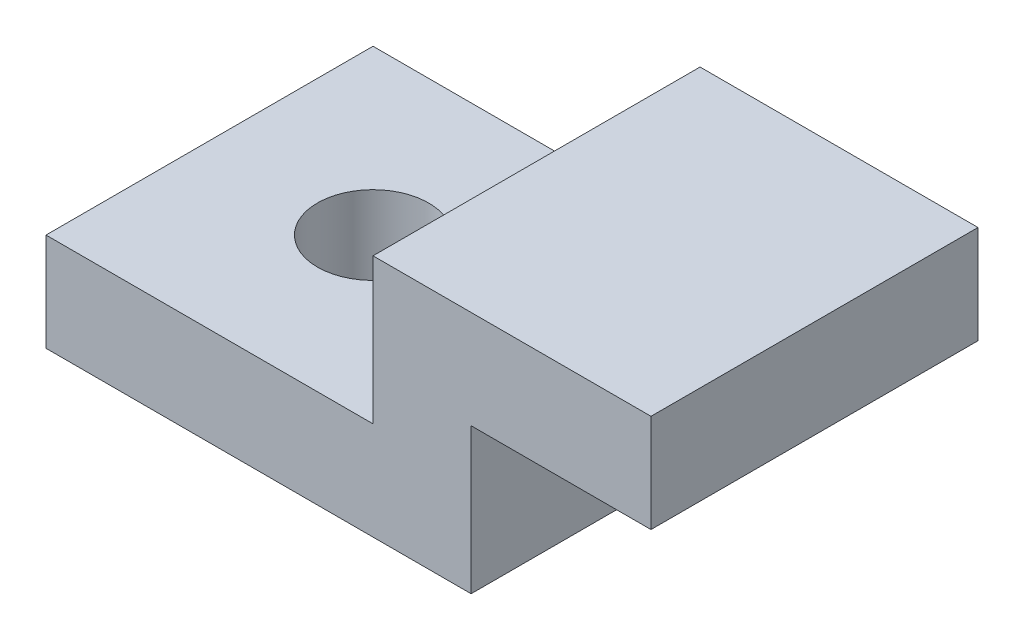
ISO-10303-21;
HEADER;
FILE_DESCRIPTION(('STEP AP214'),'2;1');
FILE_NAME('part.step','',(''),(''),'','','');
FILE_SCHEMA(('AUTOMOTIVE_DESIGN { 1 0 10303 214 1 1 1 1 }'));
ENDSEC;
DATA;
#1=APPLICATION_CONTEXT('core data for automotive mechanical design processes');
#2=APPLICATION_PROTOCOL_DEFINITION('international standard','automotive_design',2000,#1);
#3=PRODUCT_CONTEXT('',#1,'mechanical');
#4=PRODUCT('Part','Part','',(#3));
#5=PRODUCT_RELATED_PRODUCT_CATEGORY('part','',(#4));
#6=PRODUCT_DEFINITION_FORMATION('','',#4);
#7=PRODUCT_DEFINITION_CONTEXT('part definition',#1,'design');
#8=PRODUCT_DEFINITION('design','',#6,#7);
#9=PRODUCT_DEFINITION_SHAPE('','',#8);
#10=(LENGTH_UNIT() NAMED_UNIT(*) SI_UNIT(.MILLI.,.METRE.));
#11=(NAMED_UNIT(*) PLANE_ANGLE_UNIT() SI_UNIT($,.RADIAN.));
#12=(NAMED_UNIT(*) SI_UNIT($,.STERADIAN.) SOLID_ANGLE_UNIT());
#13=UNCERTAINTY_MEASURE_WITH_UNIT(LENGTH_MEASURE(1.E-05),#10,'distance_accuracy_value','');
#14=(GEOMETRIC_REPRESENTATION_CONTEXT(3) GLOBAL_UNCERTAINTY_ASSIGNED_CONTEXT((#13)) GLOBAL_UNIT_ASSIGNED_CONTEXT((#10,
#11,#12)) REPRESENTATION_CONTEXT('',''));
#15=CARTESIAN_POINT('',(0.,0.,0.));
#16=DIRECTION('',(0.,0.,1.));
#17=DIRECTION('',(1.,0.,0.));
#18=AXIS2_PLACEMENT_3D('',#15,#16,#17);
#19=CARTESIAN_POINT('',(0.,0.,5.));
#20=DIRECTION('',(-1.,0.,0.));
#21=DIRECTION('',(0.,0.,1.));
#22=AXIS2_PLACEMENT_3D('',#19,#20,#21);
#23=PLANE('',#22);
#24=DIRECTION('',(0.,1.,0.));
#25=VECTOR('',#24,1.);
#26=CARTESIAN_POINT('',(0.,0.,-5.));
#27=LINE('',#26,#25);
#28=CARTESIAN_POINT('',(0.,0.,-5.));
#29=VERTEX_POINT('',#28);
#30=CARTESIAN_POINT('',(0.,4.45,-5.));
#31=VERTEX_POINT('',#30);
#32=EDGE_CURVE('E133',#29,#31,#27,.T.);
#33=ORIENTED_EDGE('',*,*,#32,.T.);
#34=DIRECTION('',(0.,0.,-1.));
#35=VECTOR('',#34,1.);
#36=CARTESIAN_POINT('',(0.,4.45,5.));
#37=LINE('',#36,#35);
#38=CARTESIAN_POINT('',(0.,4.45,5.));
#39=VERTEX_POINT('',#38);
#40=EDGE_CURVE('E41',#39,#31,#37,.T.);
#41=ORIENTED_EDGE('',*,*,#40,.F.);
#42=DIRECTION('',(0.,1.,0.));
#43=VECTOR('',#42,1.);
#44=CARTESIAN_POINT('',(0.,0.,5.));
#45=LINE('',#44,#43);
#46=CARTESIAN_POINT('',(0.,0.,5.));
#47=VERTEX_POINT('',#46);
#48=EDGE_CURVE('E93',#47,#39,#45,.T.);
#49=ORIENTED_EDGE('',*,*,#48,.F.);
#50=DIRECTION('',(0.,0.,-1.));
#51=VECTOR('',#50,1.);
#52=CARTESIAN_POINT('',(0.,0.,5.));
#53=LINE('',#52,#51);
#54=EDGE_CURVE('E11',#47,#29,#53,.T.);
#55=ORIENTED_EDGE('',*,*,#54,.T.);
#56=EDGE_LOOP('',(#33,#41,#49,#55));
#57=FACE_BOUND('',#56,.T.);
#58=ADVANCED_FACE('F33',(#57),#23,.F.);
#59=CARTESIAN_POINT('',(0.,4.45,5.));
#60=DIRECTION('',(0.,1.,0.));
#61=DIRECTION('',(0.,0.,1.));
#62=AXIS2_PLACEMENT_3D('',#59,#60,#61);
#63=PLANE('',#62);
#64=DIRECTION('',(1.,0.,0.));
#65=VECTOR('',#64,1.);
#66=CARTESIAN_POINT('',(0.,4.45,-5.));
#67=LINE('',#66,#65);
#68=CARTESIAN_POINT('',(5.5,4.45,-5.));
#69=VERTEX_POINT('',#68);
#70=EDGE_CURVE('E135',#31,#69,#67,.T.);
#71=ORIENTED_EDGE('',*,*,#70,.T.);
#72=DIRECTION('',(0.,0.,-1.));
#73=VECTOR('',#72,1.);
#74=CARTESIAN_POINT('',(5.5,4.45,5.));
#75=LINE('',#74,#73);
#76=CARTESIAN_POINT('',(5.5,4.45,5.));
#77=VERTEX_POINT('',#76);
#78=EDGE_CURVE('E153',#77,#69,#75,.T.);
#79=ORIENTED_EDGE('',*,*,#78,.F.);
#80=DIRECTION('',(1.,0.,0.));
#81=VECTOR('',#80,1.);
#82=CARTESIAN_POINT('',(0.,4.45,5.));
#83=LINE('',#82,#81);
#84=EDGE_CURVE('E161',#39,#77,#83,.T.);
#85=ORIENTED_EDGE('',*,*,#84,.F.);
#86=ORIENTED_EDGE('',*,*,#40,.T.);
#87=EDGE_LOOP('',(#71,#79,#85,#86));
#88=FACE_BOUND('',#87,.T.);
#89=ADVANCED_FACE('F159',(#88),#63,.F.);
#90=CARTESIAN_POINT('',(5.5,4.45,5.));
#91=DIRECTION('',(-1.,0.,0.));
#92=DIRECTION('',(0.,0.,1.));
#93=AXIS2_PLACEMENT_3D('',#90,#91,#92);
#94=PLANE('',#93);
#95=DIRECTION('',(0.,1.,0.));
#96=VECTOR('',#95,1.);
#97=CARTESIAN_POINT('',(5.5,4.45,-5.));
#98=LINE('',#97,#96);
#99=CARTESIAN_POINT('',(5.5,7.45,-5.));
#100=VERTEX_POINT('',#99);
#101=EDGE_CURVE('E138',#69,#100,#98,.T.);
#102=ORIENTED_EDGE('',*,*,#101,.T.);
#103=DIRECTION('',(0.,0.,-1.));
#104=VECTOR('',#103,1.);
#105=CARTESIAN_POINT('',(5.5,7.45,5.));
#106=LINE('',#105,#104);
#107=CARTESIAN_POINT('',(5.5,7.45,5.));
#108=VERTEX_POINT('',#107);
#109=EDGE_CURVE('E150',#108,#100,#106,.T.);
#110=ORIENTED_EDGE('',*,*,#109,.F.);
#111=DIRECTION('',(0.,1.,0.));
#112=VECTOR('',#111,1.);
#113=CARTESIAN_POINT('',(5.5,4.45,5.));
#114=LINE('',#113,#112);
#115=EDGE_CURVE('E174',#77,#108,#114,.T.);
#116=ORIENTED_EDGE('',*,*,#115,.F.);
#117=ORIENTED_EDGE('',*,*,#78,.T.);
#118=EDGE_LOOP('',(#102,#110,#116,#117));
#119=FACE_BOUND('',#118,.T.);
#120=ADVANCED_FACE('F170',(#119),#94,.F.);
#121=CARTESIAN_POINT('',(5.5,7.45,5.));
#122=DIRECTION('',(0.,-1.,0.));
#123=DIRECTION('',(1.,0.,0.));
#124=AXIS2_PLACEMENT_3D('',#121,#122,#123);
#125=PLANE('',#124);
#126=DIRECTION('',(-1.,0.,0.));
#127=VECTOR('',#126,1.);
#128=CARTESIAN_POINT('',(5.5,7.45,-5.));
#129=LINE('',#128,#127);
#130=CARTESIAN_POINT('',(-3.,7.45,-5.));
#131=VERTEX_POINT('',#130);
#132=EDGE_CURVE('E140',#100,#131,#129,.T.);
#133=ORIENTED_EDGE('',*,*,#132,.T.);
#134=DIRECTION('',(0.,0.,-1.));
#135=VECTOR('',#134,1.);
#136=CARTESIAN_POINT('',(-3.,7.45,5.));
#137=LINE('',#136,#135);
#138=CARTESIAN_POINT('',(-3.,7.45,5.));
#139=VERTEX_POINT('',#138);
#140=EDGE_CURVE('E122',#139,#131,#137,.T.);
#141=ORIENTED_EDGE('',*,*,#140,.F.);
#142=DIRECTION('',(-1.,0.,0.));
#143=VECTOR('',#142,1.);
#144=CARTESIAN_POINT('',(5.5,7.45,5.));
#145=LINE('',#144,#143);
#146=EDGE_CURVE('E113',#108,#139,#145,.T.);
#147=ORIENTED_EDGE('',*,*,#146,.F.);
#148=ORIENTED_EDGE('',*,*,#109,.T.);
#149=EDGE_LOOP('',(#133,#141,#147,#148));
#150=FACE_BOUND('',#149,.T.);
#151=ADVANCED_FACE('F173',(#150),#125,.F.);
#152=CARTESIAN_POINT('',(-3.,7.45,5.));
#153=DIRECTION('',(1.,0.,0.));
#154=DIRECTION('',(0.,1.,0.));
#155=AXIS2_PLACEMENT_3D('',#152,#153,#154);
#156=PLANE('',#155);
#157=DIRECTION('',(0.,-1.,0.));
#158=VECTOR('',#157,1.);
#159=CARTESIAN_POINT('',(-3.,7.45,-5.));
#160=LINE('',#159,#158);
#161=CARTESIAN_POINT('',(-3.,3.,-5.));
#162=VERTEX_POINT('',#161);
#163=EDGE_CURVE('E121',#131,#162,#160,.T.);
#164=ORIENTED_EDGE('',*,*,#163,.T.);
#165=DIRECTION('',(0.,0.,-1.));
#166=VECTOR('',#165,1.);
#167=CARTESIAN_POINT('',(-3.,3.,5.));
#168=LINE('',#167,#166);
#169=CARTESIAN_POINT('',(-3.,3.,5.));
#170=VERTEX_POINT('',#169);
#171=EDGE_CURVE('E118',#170,#162,#168,.T.);
#172=ORIENTED_EDGE('',*,*,#171,.F.);
#173=DIRECTION('',(0.,-1.,0.));
#174=VECTOR('',#173,1.);
#175=CARTESIAN_POINT('',(-3.,7.45,5.));
#176=LINE('',#175,#174);
#177=EDGE_CURVE('E107',#139,#170,#176,.T.);
#178=ORIENTED_EDGE('',*,*,#177,.F.);
#179=ORIENTED_EDGE('',*,*,#140,.T.);
#180=EDGE_LOOP('',(#164,#172,#178,#179));
#181=FACE_BOUND('',#180,.T.);
#182=ADVANCED_FACE('F119',(#181),#156,.F.);
#183=CARTESIAN_POINT('',(-13.,3.,5.));
#184=DIRECTION('',(0.,-1.,0.));
#185=DIRECTION('',(0.,0.,-1.));
#186=AXIS2_PLACEMENT_3D('',#183,#184,#185);
#187=PLANE('',#186);
#188=CARTESIAN_POINT('',(-8.,3.,0.));
#189=DIRECTION('',(0.,1.,0.));
#190=DIRECTION('',(0.,0.,1.));
#191=AXIS2_PLACEMENT_3D('',#188,#189,#190);
#192=CIRCLE('',#191,1.69999999999999);
#193=CARTESIAN_POINT('',(-8.,3.,1.69999999999999));
#194=VERTEX_POINT('',#193);
#195=EDGE_CURVE('E182',#194,#194,#192,.T.);
#196=ORIENTED_EDGE('',*,*,#195,.F.);
#197=EDGE_LOOP('',(#196));
#198=FACE_BOUND('',#197,.T.);
#199=DIRECTION('',(-1.,0.,0.));
#200=VECTOR('',#199,1.);
#201=CARTESIAN_POINT('',(-13.,3.,-5.));
#202=LINE('',#201,#200);
#203=CARTESIAN_POINT('',(-13.,3.,-5.));
#204=VERTEX_POINT('',#203);
#205=EDGE_CURVE('E79',#162,#204,#202,.T.);
#206=ORIENTED_EDGE('',*,*,#205,.T.);
#207=DIRECTION('',(0.,0.,-1.));
#208=VECTOR('',#207,1.);
#209=CARTESIAN_POINT('',(-13.,3.,5.));
#210=LINE('',#209,#208);
#211=CARTESIAN_POINT('',(-13.,3.,5.));
#212=VERTEX_POINT('',#211);
#213=EDGE_CURVE('E123',#212,#204,#210,.T.);
#214=ORIENTED_EDGE('',*,*,#213,.F.);
#215=DIRECTION('',(-1.,0.,0.));
#216=VECTOR('',#215,1.);
#217=CARTESIAN_POINT('',(-13.,3.,5.));
#218=LINE('',#217,#216);
#219=EDGE_CURVE('E111',#170,#212,#218,.T.);
#220=ORIENTED_EDGE('',*,*,#219,.F.);
#221=ORIENTED_EDGE('',*,*,#171,.T.);
#222=EDGE_LOOP('',(#206,#214,#220,#221));
#223=FACE_BOUND('',#222,.T.);
#224=ADVANCED_FACE('F125',(#198,#223),#187,.F.);
#225=CARTESIAN_POINT('',(-13.,0.,5.));
#226=DIRECTION('',(1.,0.,0.));
#227=DIRECTION('',(0.,0.,-1.));
#228=AXIS2_PLACEMENT_3D('',#225,#226,#227);
#229=PLANE('',#228);
#230=DIRECTION('',(0.,-1.,0.));
#231=VECTOR('',#230,1.);
#232=CARTESIAN_POINT('',(-13.,0.,-5.));
#233=LINE('',#232,#231);
#234=CARTESIAN_POINT('',(-13.,0.,-5.));
#235=VERTEX_POINT('',#234);
#236=EDGE_CURVE('E86',#204,#235,#233,.T.);
#237=ORIENTED_EDGE('',*,*,#236,.T.);
#238=DIRECTION('',(0.,0.,-1.));
#239=VECTOR('',#238,1.);
#240=CARTESIAN_POINT('',(-13.,0.,5.));
#241=LINE('',#240,#239);
#242=CARTESIAN_POINT('',(-13.,0.,5.));
#243=VERTEX_POINT('',#242);
#244=EDGE_CURVE('E129',#243,#235,#241,.T.);
#245=ORIENTED_EDGE('',*,*,#244,.F.);
#246=DIRECTION('',(0.,-1.,0.));
#247=VECTOR('',#246,1.);
#248=CARTESIAN_POINT('',(-13.,0.,5.));
#249=LINE('',#248,#247);
#250=EDGE_CURVE('E127',#212,#243,#249,.T.);
#251=ORIENTED_EDGE('',*,*,#250,.F.);
#252=ORIENTED_EDGE('',*,*,#213,.T.);
#253=EDGE_LOOP('',(#237,#245,#251,#252));
#254=FACE_BOUND('',#253,.T.);
#255=ADVANCED_FACE('F189',(#254),#229,.F.);
#256=CARTESIAN_POINT('',(-3.,0.,5.));
#257=DIRECTION('',(0.,1.,0.));
#258=DIRECTION('',(-1.,0.,0.));
#259=AXIS2_PLACEMENT_3D('',#256,#257,#258);
#260=PLANE('',#259);
#261=CARTESIAN_POINT('',(-8.,0.,0.));
#262=DIRECTION('',(0.,1.,0.));
#263=DIRECTION('',(0.,0.,1.));
#264=AXIS2_PLACEMENT_3D('',#261,#262,#263);
#265=CIRCLE('',#264,1.7);
#266=CARTESIAN_POINT('',(-8.,0.,1.7));
#267=VERTEX_POINT('',#266);
#268=EDGE_CURVE('E136',#267,#267,#265,.T.);
#269=ORIENTED_EDGE('',*,*,#268,.T.);
#270=EDGE_LOOP('',(#269));
#271=FACE_BOUND('',#270,.T.);
#272=DIRECTION('',(1.,0.,0.));
#273=VECTOR('',#272,1.);
#274=CARTESIAN_POINT('',(-3.,0.,-5.));
#275=LINE('',#274,#273);
#276=EDGE_CURVE('E145',#235,#29,#275,.T.);
#277=ORIENTED_EDGE('',*,*,#276,.T.);
#278=ORIENTED_EDGE('',*,*,#54,.F.);
#279=DIRECTION('',(1.,0.,0.));
#280=VECTOR('',#279,1.);
#281=CARTESIAN_POINT('',(-3.,0.,5.));
#282=LINE('',#281,#280);
#283=EDGE_CURVE('E49',#243,#47,#282,.T.);
#284=ORIENTED_EDGE('',*,*,#283,.F.);
#285=ORIENTED_EDGE('',*,*,#244,.T.);
#286=EDGE_LOOP('',(#277,#278,#284,#285));
#287=FACE_BOUND('',#286,.T.);
#288=ADVANCED_FACE('F195',(#271,#287),#260,.F.);
#289=CARTESIAN_POINT('',(0.,0.,5.));
#290=DIRECTION('',(0.,0.,1.));
#291=DIRECTION('',(1.,0.,0.));
#292=AXIS2_PLACEMENT_3D('',#289,#290,#291);
#293=PLANE('',#292);
#294=ORIENTED_EDGE('',*,*,#283,.T.);
#295=ORIENTED_EDGE('',*,*,#48,.T.);
#296=ORIENTED_EDGE('',*,*,#84,.T.);
#297=ORIENTED_EDGE('',*,*,#115,.T.);
#298=ORIENTED_EDGE('',*,*,#146,.T.);
#299=ORIENTED_EDGE('',*,*,#177,.T.);
#300=ORIENTED_EDGE('',*,*,#219,.T.);
#301=ORIENTED_EDGE('',*,*,#250,.T.);
#302=EDGE_LOOP('',(#294,#295,#296,#297,#298,#299,#300,#301));
#303=FACE_BOUND('',#302,.T.);
#304=ADVANCED_FACE('F109',(#303),#293,.T.);
#305=CARTESIAN_POINT('',(0.,0.,-5.));
#306=DIRECTION('',(0.,0.,1.));
#307=DIRECTION('',(1.,0.,0.));
#308=AXIS2_PLACEMENT_3D('',#305,#306,#307);
#309=PLANE('',#308);
#310=ORIENTED_EDGE('',*,*,#32,.F.);
#311=ORIENTED_EDGE('',*,*,#276,.F.);
#312=ORIENTED_EDGE('',*,*,#236,.F.);
#313=ORIENTED_EDGE('',*,*,#205,.F.);
#314=ORIENTED_EDGE('',*,*,#163,.F.);
#315=ORIENTED_EDGE('',*,*,#132,.F.);
#316=ORIENTED_EDGE('',*,*,#101,.F.);
#317=ORIENTED_EDGE('',*,*,#70,.F.);
#318=EDGE_LOOP('',(#310,#311,#312,#313,#314,#315,#316,#317));
#319=FACE_BOUND('',#318,.T.);
#320=ADVANCED_FACE('F165',(#319),#309,.F.);
#321=CARTESIAN_POINT('',(-8.,3.,0.));
#322=DIRECTION('',(0.,1.,0.));
#323=DIRECTION('',(0.,0.,1.));
#324=AXIS2_PLACEMENT_3D('',#321,#322,#323);
#325=CYLINDRICAL_SURFACE('',#324,1.69999999999999);
#326=ORIENTED_EDGE('',*,*,#268,.F.);
#327=EDGE_LOOP('',(#326));
#328=FACE_BOUND('',#327,.T.);
#329=ORIENTED_EDGE('',*,*,#195,.T.);
#330=EDGE_LOOP('',(#329));
#331=FACE_BOUND('',#330,.T.);
#332=ADVANCED_FACE('F186',(#328,#331),#325,.F.);
#333=CLOSED_SHELL('',(#58,#89,#120,#151,#182,#224,#255,#288,#304,#320,#332));
#334=MANIFOLD_SOLID_BREP('B2',#333);
#335=ADVANCED_BREP_SHAPE_REPRESENTATION('',(#18,#334),#14);
#336=SHAPE_DEFINITION_REPRESENTATION(#9,#335);
ENDSEC;
END-ISO-10303-21;
